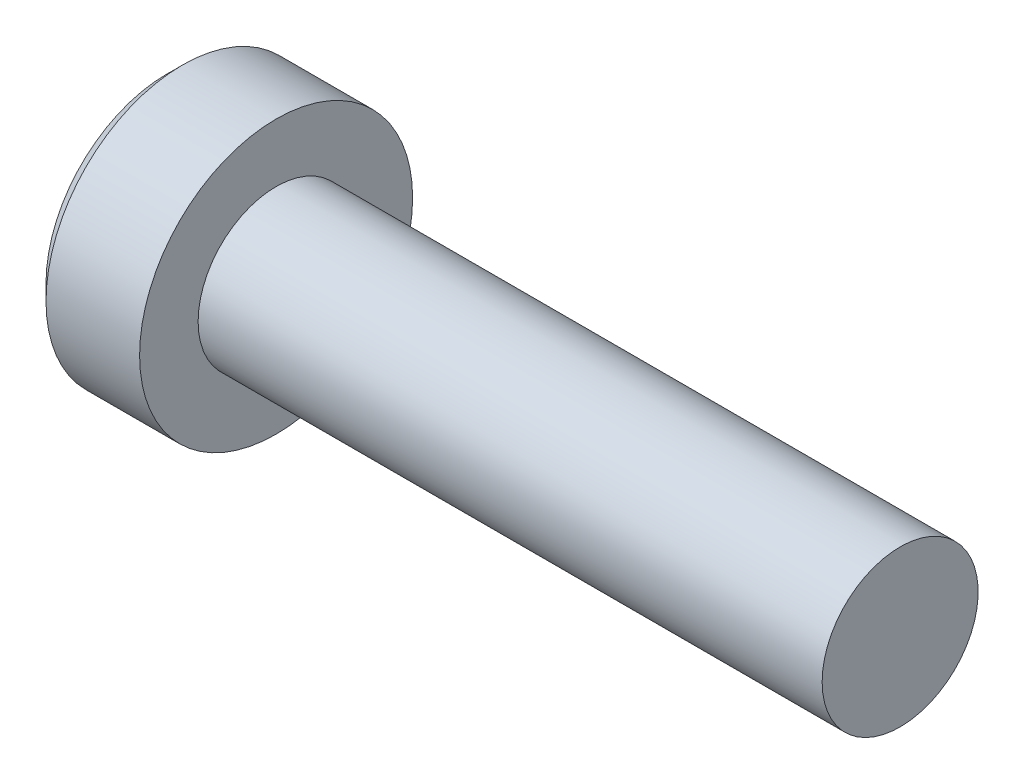
ISO-10303-21;
HEADER;
FILE_DESCRIPTION(('STEP AP214'),'2;1');
FILE_NAME('part.step','',(''),(''),'','','');
FILE_SCHEMA(('AUTOMOTIVE_DESIGN { 1 0 10303 214 1 1 1 1 }'));
ENDSEC;
DATA;
#1=APPLICATION_CONTEXT('core data for automotive mechanical design processes');
#2=APPLICATION_PROTOCOL_DEFINITION('international standard','automotive_design',2000,#1);
#3=PRODUCT_CONTEXT('',#1,'mechanical');
#4=PRODUCT('Part','Part','',(#3));
#5=PRODUCT_RELATED_PRODUCT_CATEGORY('part','',(#4));
#6=PRODUCT_DEFINITION_FORMATION('','',#4);
#7=PRODUCT_DEFINITION_CONTEXT('part definition',#1,'design');
#8=PRODUCT_DEFINITION('design','',#6,#7);
#9=PRODUCT_DEFINITION_SHAPE('','',#8);
#10=(LENGTH_UNIT() NAMED_UNIT(*) SI_UNIT(.MILLI.,.METRE.));
#11=(NAMED_UNIT(*) PLANE_ANGLE_UNIT() SI_UNIT($,.RADIAN.));
#12=(NAMED_UNIT(*) SI_UNIT($,.STERADIAN.) SOLID_ANGLE_UNIT());
#13=UNCERTAINTY_MEASURE_WITH_UNIT(LENGTH_MEASURE(1.E-05),#10,'distance_accuracy_value','');
#14=(GEOMETRIC_REPRESENTATION_CONTEXT(3) GLOBAL_UNCERTAINTY_ASSIGNED_CONTEXT((#13)) GLOBAL_UNIT_ASSIGNED_CONTEXT((#10,
#11,#12)) REPRESENTATION_CONTEXT('',''));
#15=CARTESIAN_POINT('',(0.,0.,0.));
#16=DIRECTION('',(0.,0.,1.));
#17=DIRECTION('',(1.,0.,0.));
#18=AXIS2_PLACEMENT_3D('',#15,#16,#17);
#19=CARTESIAN_POINT('',(-0.799999999999999,0.,0.));
#20=DIRECTION('',(-1.,0.,0.));
#21=DIRECTION('',(0.,0.,1.));
#22=AXIS2_PLACEMENT_3D('',#19,#20,#21);
#23=PLANE('',#22);
#24=CARTESIAN_POINT('',(-0.799999999999999,0.,0.));
#25=DIRECTION('',(-1.,0.,0.));
#26=DIRECTION('',(0.,0.,1.));
#27=AXIS2_PLACEMENT_3D('',#24,#25,#26);
#28=CIRCLE('',#27,1.5);
#29=CARTESIAN_POINT('',(-0.799999999999999,0.,1.5));
#30=VERTEX_POINT('',#29);
#31=CARTESIAN_POINT('',(-0.799999999999999,1.29903810567666,0.75));
#32=VERTEX_POINT('',#31);
#33=EDGE_CURVE('E190',#30,#32,#28,.T.);
#34=ORIENTED_EDGE('',*,*,#33,.F.);
#35=DIRECTION('',(0.,1.,0.));
#36=VECTOR('',#35,1.);
#37=CARTESIAN_POINT('',(-0.799999999999999,-0.86602540378444,1.5));
#38=LINE('',#37,#36);
#39=CARTESIAN_POINT('',(-0.799999999999999,0.866025403784438,1.5));
#40=VERTEX_POINT('',#39);
#41=EDGE_CURVE('E243',#30,#40,#38,.T.);
#42=ORIENTED_EDGE('',*,*,#41,.T.);
#43=DIRECTION('',(0.,0.5,-0.866025403784439));
#44=VECTOR('',#43,1.);
#45=CARTESIAN_POINT('',(-0.799999999999999,0.866025403784438,1.5));
#46=LINE('',#45,#44);
#47=EDGE_CURVE('E264',#40,#32,#46,.T.);
#48=ORIENTED_EDGE('',*,*,#47,.T.);
#49=EDGE_LOOP('',(#34,#42,#48));
#50=FACE_BOUND('',#49,.T.);
#51=ADVANCED_FACE('F41',(#50),#23,.T.);
#52=CARTESIAN_POINT('',(-0.799999999999999,1.29903810567666,-0.75));
#53=VERTEX_POINT('',#52);
#54=EDGE_CURVE('E196',#32,#53,#28,.T.);
#55=ORIENTED_EDGE('',*,*,#54,.F.);
#56=CARTESIAN_POINT('',(-0.799999999999999,1.73205080756888,0.));
#57=VERTEX_POINT('',#56);
#58=EDGE_CURVE('E223',#32,#57,#46,.T.);
#59=ORIENTED_EDGE('',*,*,#58,.T.);
#60=DIRECTION('',(0.,-0.5,-0.866025403784439));
#61=VECTOR('',#60,1.);
#62=CARTESIAN_POINT('',(-0.799999999999999,1.73205080756888,0.));
#63=LINE('',#62,#61);
#64=EDGE_CURVE('E261',#57,#53,#63,.T.);
#65=ORIENTED_EDGE('',*,*,#64,.T.);
#66=EDGE_LOOP('',(#55,#59,#65));
#67=FACE_BOUND('',#66,.T.);
#68=ADVANCED_FACE('F128',(#67),#23,.T.);
#69=CARTESIAN_POINT('',(-0.799999999999999,0.,-1.5));
#70=VERTEX_POINT('',#69);
#71=EDGE_CURVE('E198',#53,#70,#28,.T.);
#72=ORIENTED_EDGE('',*,*,#71,.F.);
#73=CARTESIAN_POINT('',(-0.799999999999999,0.866025403784438,-1.5));
#74=VERTEX_POINT('',#73);
#75=EDGE_CURVE('E263',#53,#74,#63,.T.);
#76=ORIENTED_EDGE('',*,*,#75,.T.);
#77=DIRECTION('',(0.,-1.,0.));
#78=VECTOR('',#77,1.);
#79=CARTESIAN_POINT('',(-0.799999999999999,0.866025403784438,-1.5));
#80=LINE('',#79,#78);
#81=EDGE_CURVE('E257',#74,#70,#80,.T.);
#82=ORIENTED_EDGE('',*,*,#81,.T.);
#83=EDGE_LOOP('',(#72,#76,#82));
#84=FACE_BOUND('',#83,.T.);
#85=ADVANCED_FACE('F133',(#84),#23,.T.);
#86=CARTESIAN_POINT('',(-0.799999999999999,-1.29903810567666,-0.75));
#87=VERTEX_POINT('',#86);
#88=EDGE_CURVE('E201',#70,#87,#28,.T.);
#89=ORIENTED_EDGE('',*,*,#88,.F.);
#90=CARTESIAN_POINT('',(-0.799999999999999,-0.866025403784439,-1.5));
#91=VERTEX_POINT('',#90);
#92=EDGE_CURVE('E260',#70,#91,#80,.T.);
#93=ORIENTED_EDGE('',*,*,#92,.T.);
#94=DIRECTION('',(0.,-0.5,0.866025403784439));
#95=VECTOR('',#94,1.);
#96=CARTESIAN_POINT('',(-0.799999999999999,-0.866025403784439,-1.5));
#97=LINE('',#96,#95);
#98=EDGE_CURVE('E252',#91,#87,#97,.T.);
#99=ORIENTED_EDGE('',*,*,#98,.T.);
#100=EDGE_LOOP('',(#89,#93,#99));
#101=FACE_BOUND('',#100,.T.);
#102=ADVANCED_FACE('F180',(#101),#23,.T.);
#103=CARTESIAN_POINT('',(-0.799999999999999,-1.29903810567666,0.75));
#104=VERTEX_POINT('',#103);
#105=EDGE_CURVE('E56',#87,#104,#28,.T.);
#106=ORIENTED_EDGE('',*,*,#105,.F.);
#107=CARTESIAN_POINT('',(-0.799999999999999,-1.73205080756888,0.));
#108=VERTEX_POINT('',#107);
#109=EDGE_CURVE('E256',#87,#108,#97,.T.);
#110=ORIENTED_EDGE('',*,*,#109,.T.);
#111=DIRECTION('',(0.,0.5,0.866025403784439));
#112=VECTOR('',#111,1.);
#113=CARTESIAN_POINT('',(-0.799999999999999,-1.73205080756888,0.));
#114=LINE('',#113,#112);
#115=EDGE_CURVE('E245',#108,#104,#114,.T.);
#116=ORIENTED_EDGE('',*,*,#115,.T.);
#117=EDGE_LOOP('',(#106,#110,#116));
#118=FACE_BOUND('',#117,.T.);
#119=ADVANCED_FACE('F126',(#118),#23,.T.);
#120=CARTESIAN_POINT('',(16.,0.,0.));
#121=DIRECTION('',(-1.,0.,0.));
#122=DIRECTION('',(0.,0.,1.));
#123=AXIS2_PLACEMENT_3D('',#120,#121,#122);
#124=PLANE('',#123);
#125=CARTESIAN_POINT('',(16.,0.,0.));
#126=DIRECTION('',(-1.,0.,0.));
#127=DIRECTION('',(0.,0.,1.));
#128=AXIS2_PLACEMENT_3D('',#125,#126,#127);
#129=CIRCLE('',#128,2.);
#130=CARTESIAN_POINT('',(16.,0.,2.));
#131=VERTEX_POINT('',#130);
#132=EDGE_CURVE('E184',#131,#131,#129,.T.);
#133=ORIENTED_EDGE('',*,*,#132,.F.);
#134=EDGE_LOOP('',(#133));
#135=FACE_BOUND('',#134,.T.);
#136=ADVANCED_FACE('F173',(#135),#124,.F.);
#137=CARTESIAN_POINT('',(-2.8,0.,0.));
#138=DIRECTION('',(-1.,0.,0.));
#139=DIRECTION('',(0.,0.,1.));
#140=AXIS2_PLACEMENT_3D('',#137,#138,#139);
#141=CYLINDRICAL_SURFACE('',#140,2.);
#142=CARTESIAN_POINT('',(0.,0.,0.));
#143=DIRECTION('',(-1.,0.,0.));
#144=DIRECTION('',(0.,0.,1.));
#145=AXIS2_PLACEMENT_3D('',#142,#143,#144);
#146=CIRCLE('',#145,2.);
#147=CARTESIAN_POINT('',(0.,0.,2.));
#148=VERTEX_POINT('',#147);
#149=EDGE_CURVE('E187',#148,#148,#146,.T.);
#150=ORIENTED_EDGE('',*,*,#149,.F.);
#151=EDGE_LOOP('',(#150));
#152=FACE_BOUND('',#151,.T.);
#153=ORIENTED_EDGE('',*,*,#132,.T.);
#154=EDGE_LOOP('',(#153));
#155=FACE_BOUND('',#154,.T.);
#156=ADVANCED_FACE('F170',(#152,#155),#141,.T.);
#157=CARTESIAN_POINT('',(0.,2.,0.));
#158=DIRECTION('',(-1.,0.,0.));
#159=DIRECTION('',(0.,0.,1.));
#160=AXIS2_PLACEMENT_3D('',#157,#158,#159);
#161=PLANE('',#160);
#162=CARTESIAN_POINT('',(0.,0.,0.));
#163=DIRECTION('',(-1.,0.,0.));
#164=DIRECTION('',(0.,0.,1.));
#165=AXIS2_PLACEMENT_3D('',#162,#163,#164);
#166=CIRCLE('',#165,3.5);
#167=CARTESIAN_POINT('',(0.,0.,3.5));
#168=VERTEX_POINT('',#167);
#169=EDGE_CURVE('E192',#168,#168,#166,.T.);
#170=ORIENTED_EDGE('',*,*,#169,.F.);
#171=EDGE_LOOP('',(#170));
#172=FACE_BOUND('',#171,.T.);
#173=ORIENTED_EDGE('',*,*,#149,.T.);
#174=EDGE_LOOP('',(#173));
#175=FACE_BOUND('',#174,.T.);
#176=ADVANCED_FACE('F166',(#172,#175),#161,.F.);
#177=CARTESIAN_POINT('',(-2.8,0.,0.));
#178=DIRECTION('',(-1.,0.,0.));
#179=DIRECTION('',(0.,0.,1.));
#180=AXIS2_PLACEMENT_3D('',#177,#178,#179);
#181=CYLINDRICAL_SURFACE('',#180,3.5);
#182=CARTESIAN_POINT('',(-2.4,0.,0.));
#183=DIRECTION('',(1.,0.,0.));
#184=DIRECTION('',(0.,0.,-1.));
#185=AXIS2_PLACEMENT_3D('',#182,#183,#184);
#186=CIRCLE('',#185,3.5);
#187=CARTESIAN_POINT('',(-2.4,0.,-3.5));
#188=VERTEX_POINT('',#187);
#189=EDGE_CURVE('E11',#188,#188,#186,.T.);
#190=ORIENTED_EDGE('',*,*,#189,.T.);
#191=EDGE_LOOP('',(#190));
#192=FACE_BOUND('',#191,.T.);
#193=ORIENTED_EDGE('',*,*,#169,.T.);
#194=EDGE_LOOP('',(#193));
#195=FACE_BOUND('',#194,.T.);
#196=ADVANCED_FACE('F162',(#192,#195),#181,.T.);
#197=CARTESIAN_POINT('',(-2.8,3.5,0.));
#198=DIRECTION('',(1.,0.,0.));
#199=DIRECTION('',(0.,0.,-1.));
#200=AXIS2_PLACEMENT_3D('',#197,#198,#199);
#201=PLANE('',#200);
#202=CARTESIAN_POINT('',(-2.8,0.,0.));
#203=DIRECTION('',(1.,0.,0.));
#204=DIRECTION('',(0.,0.,-1.));
#205=AXIS2_PLACEMENT_3D('',#202,#203,#204);
#206=CIRCLE('',#205,3.1);
#207=CARTESIAN_POINT('',(-2.8,0.,-3.1));
#208=VERTEX_POINT('',#207);
#209=EDGE_CURVE('E49',#208,#208,#206,.F.);
#210=ORIENTED_EDGE('',*,*,#209,.T.);
#211=EDGE_LOOP('',(#210));
#212=FACE_BOUND('',#211,.T.);
#213=DIRECTION('',(0.,-0.5,-0.866025403784439));
#214=VECTOR('',#213,1.);
#215=CARTESIAN_POINT('',(-2.8,1.73205080756888,0.));
#216=LINE('',#215,#214);
#217=CARTESIAN_POINT('',(-2.8,1.73205080756888,0.));
#218=VERTEX_POINT('',#217);
#219=CARTESIAN_POINT('',(-2.8,0.866025403784438,-1.5));
#220=VERTEX_POINT('',#219);
#221=EDGE_CURVE('E203',#218,#220,#216,.T.);
#222=ORIENTED_EDGE('',*,*,#221,.F.);
#223=DIRECTION('',(0.,0.5,-0.866025403784439));
#224=VECTOR('',#223,1.);
#225=CARTESIAN_POINT('',(-2.8,0.866025403784438,1.5));
#226=LINE('',#225,#224);
#227=CARTESIAN_POINT('',(-2.8,0.866025403784438,1.5));
#228=VERTEX_POINT('',#227);
#229=EDGE_CURVE('E64',#228,#218,#226,.T.);
#230=ORIENTED_EDGE('',*,*,#229,.F.);
#231=DIRECTION('',(0.,1.,0.));
#232=VECTOR('',#231,1.);
#233=CARTESIAN_POINT('',(-2.8,-0.86602540378444,1.5));
#234=LINE('',#233,#232);
#235=CARTESIAN_POINT('',(-2.8,-0.86602540378444,1.5));
#236=VERTEX_POINT('',#235);
#237=EDGE_CURVE('E220',#236,#228,#234,.T.);
#238=ORIENTED_EDGE('',*,*,#237,.F.);
#239=DIRECTION('',(0.,0.5,0.866025403784439));
#240=VECTOR('',#239,1.);
#241=CARTESIAN_POINT('',(-2.8,-1.73205080756888,0.));
#242=LINE('',#241,#240);
#243=CARTESIAN_POINT('',(-2.8,-1.73205080756888,0.));
#244=VERTEX_POINT('',#243);
#245=EDGE_CURVE('E217',#244,#236,#242,.T.);
#246=ORIENTED_EDGE('',*,*,#245,.F.);
#247=DIRECTION('',(0.,-0.5,0.866025403784439));
#248=VECTOR('',#247,1.);
#249=CARTESIAN_POINT('',(-2.8,-0.866025403784439,-1.5));
#250=LINE('',#249,#248);
#251=CARTESIAN_POINT('',(-2.8,-0.866025403784439,-1.5));
#252=VERTEX_POINT('',#251);
#253=EDGE_CURVE('E214',#252,#244,#250,.T.);
#254=ORIENTED_EDGE('',*,*,#253,.F.);
#255=DIRECTION('',(0.,-1.,0.));
#256=VECTOR('',#255,1.);
#257=CARTESIAN_POINT('',(-2.8,0.866025403784438,-1.5));
#258=LINE('',#257,#256);
#259=EDGE_CURVE('E206',#220,#252,#258,.T.);
#260=ORIENTED_EDGE('',*,*,#259,.F.);
#261=EDGE_LOOP('',(#222,#230,#238,#246,#254,#260));
#262=FACE_BOUND('',#261,.T.);
#263=ADVANCED_FACE('F159',(#212,#262),#201,.F.);
#264=CARTESIAN_POINT('',(-0.799999999999999,0.866025403784438,1.5));
#265=DIRECTION('',(0.,0.866025403784439,0.5));
#266=DIRECTION('',(0.,-0.5,0.866025403784439));
#267=AXIS2_PLACEMENT_3D('',#264,#265,#266);
#268=PLANE('',#267);
#269=ORIENTED_EDGE('',*,*,#229,.T.);
#270=DIRECTION('',(-1.,0.,0.));
#271=VECTOR('',#270,1.);
#272=CARTESIAN_POINT('',(-0.799999999999999,1.73205080756888,0.));
#273=LINE('',#272,#271);
#274=EDGE_CURVE('E234',#57,#218,#273,.T.);
#275=ORIENTED_EDGE('',*,*,#274,.F.);
#276=ORIENTED_EDGE('',*,*,#58,.F.);
#277=ORIENTED_EDGE('',*,*,#47,.F.);
#278=DIRECTION('',(-1.,0.,0.));
#279=VECTOR('',#278,1.);
#280=CARTESIAN_POINT('',(-0.799999999999999,0.866025403784438,1.5));
#281=LINE('',#280,#279);
#282=EDGE_CURVE('E224',#40,#228,#281,.T.);
#283=ORIENTED_EDGE('',*,*,#282,.T.);
#284=EDGE_LOOP('',(#269,#275,#276,#277,#283));
#285=FACE_BOUND('',#284,.T.);
#286=ADVANCED_FACE('F141',(#285),#268,.F.);
#287=CARTESIAN_POINT('',(-0.799999999999999,-0.86602540378444,1.5));
#288=DIRECTION('',(0.,0.,1.));
#289=DIRECTION('',(1.,0.,0.));
#290=AXIS2_PLACEMENT_3D('',#287,#288,#289);
#291=PLANE('',#290);
#292=ORIENTED_EDGE('',*,*,#237,.T.);
#293=ORIENTED_EDGE('',*,*,#282,.F.);
#294=ORIENTED_EDGE('',*,*,#41,.F.);
#295=CARTESIAN_POINT('',(-0.799999999999999,-0.86602540378444,1.5));
#296=VERTEX_POINT('',#295);
#297=EDGE_CURVE('E209',#296,#30,#38,.T.);
#298=ORIENTED_EDGE('',*,*,#297,.F.);
#299=DIRECTION('',(-1.,0.,0.));
#300=VECTOR('',#299,1.);
#301=CARTESIAN_POINT('',(-0.799999999999999,-0.86602540378444,1.5));
#302=LINE('',#301,#300);
#303=EDGE_CURVE('E226',#296,#236,#302,.T.);
#304=ORIENTED_EDGE('',*,*,#303,.T.);
#305=EDGE_LOOP('',(#292,#293,#294,#298,#304));
#306=FACE_BOUND('',#305,.T.);
#307=ADVANCED_FACE('F137',(#306),#291,.F.);
#308=CARTESIAN_POINT('',(-0.799999999999999,-1.73205080756888,0.));
#309=DIRECTION('',(0.,-0.866025403784439,0.5));
#310=DIRECTION('',(0.,-0.5,-0.866025403784439));
#311=AXIS2_PLACEMENT_3D('',#308,#309,#310);
#312=PLANE('',#311);
#313=ORIENTED_EDGE('',*,*,#245,.T.);
#314=ORIENTED_EDGE('',*,*,#303,.F.);
#315=EDGE_CURVE('E250',#104,#296,#114,.T.);
#316=ORIENTED_EDGE('',*,*,#315,.F.);
#317=ORIENTED_EDGE('',*,*,#115,.F.);
#318=DIRECTION('',(-1.,0.,0.));
#319=VECTOR('',#318,1.);
#320=CARTESIAN_POINT('',(-0.799999999999999,-1.73205080756888,0.));
#321=LINE('',#320,#319);
#322=EDGE_CURVE('E228',#108,#244,#321,.T.);
#323=ORIENTED_EDGE('',*,*,#322,.T.);
#324=EDGE_LOOP('',(#313,#314,#316,#317,#323));
#325=FACE_BOUND('',#324,.T.);
#326=ADVANCED_FACE('F140',(#325),#312,.F.);
#327=CARTESIAN_POINT('',(-0.799999999999999,-0.866025403784439,-1.5));
#328=DIRECTION('',(0.,-0.866025403784439,-0.5));
#329=DIRECTION('',(0.,0.5,-0.866025403784439));
#330=AXIS2_PLACEMENT_3D('',#327,#328,#329);
#331=PLANE('',#330);
#332=ORIENTED_EDGE('',*,*,#253,.T.);
#333=ORIENTED_EDGE('',*,*,#322,.F.);
#334=ORIENTED_EDGE('',*,*,#109,.F.);
#335=ORIENTED_EDGE('',*,*,#98,.F.);
#336=DIRECTION('',(-1.,0.,0.));
#337=VECTOR('',#336,1.);
#338=CARTESIAN_POINT('',(-0.799999999999999,-0.866025403784439,-1.5));
#339=LINE('',#338,#337);
#340=EDGE_CURVE('E230',#91,#252,#339,.T.);
#341=ORIENTED_EDGE('',*,*,#340,.T.);
#342=EDGE_LOOP('',(#332,#333,#334,#335,#341));
#343=FACE_BOUND('',#342,.T.);
#344=ADVANCED_FACE('F145',(#343),#331,.F.);
#345=CARTESIAN_POINT('',(-0.799999999999999,0.866025403784438,-1.5));
#346=DIRECTION('',(0.,0.,-1.));
#347=DIRECTION('',(-1.,0.,0.));
#348=AXIS2_PLACEMENT_3D('',#345,#346,#347);
#349=PLANE('',#348);
#350=ORIENTED_EDGE('',*,*,#259,.T.);
#351=ORIENTED_EDGE('',*,*,#340,.F.);
#352=ORIENTED_EDGE('',*,*,#92,.F.);
#353=ORIENTED_EDGE('',*,*,#81,.F.);
#354=DIRECTION('',(-1.,0.,0.));
#355=VECTOR('',#354,1.);
#356=CARTESIAN_POINT('',(-0.799999999999999,0.866025403784438,-1.5));
#357=LINE('',#356,#355);
#358=EDGE_CURVE('E232',#74,#220,#357,.T.);
#359=ORIENTED_EDGE('',*,*,#358,.T.);
#360=EDGE_LOOP('',(#350,#351,#352,#353,#359));
#361=FACE_BOUND('',#360,.T.);
#362=ADVANCED_FACE('F149',(#361),#349,.F.);
#363=CARTESIAN_POINT('',(-0.799999999999999,1.73205080756888,0.));
#364=DIRECTION('',(0.,0.866025403784439,-0.5));
#365=DIRECTION('',(0.,0.5,0.866025403784439));
#366=AXIS2_PLACEMENT_3D('',#363,#364,#365);
#367=PLANE('',#366);
#368=ORIENTED_EDGE('',*,*,#221,.T.);
#369=ORIENTED_EDGE('',*,*,#358,.F.);
#370=ORIENTED_EDGE('',*,*,#75,.F.);
#371=ORIENTED_EDGE('',*,*,#64,.F.);
#372=ORIENTED_EDGE('',*,*,#274,.T.);
#373=EDGE_LOOP('',(#368,#369,#370,#371,#372));
#374=FACE_BOUND('',#373,.T.);
#375=ADVANCED_FACE('F123',(#374),#367,.F.);
#376=EDGE_CURVE('E186',#104,#30,#28,.T.);
#377=ORIENTED_EDGE('',*,*,#376,.F.);
#378=ORIENTED_EDGE('',*,*,#315,.T.);
#379=ORIENTED_EDGE('',*,*,#297,.T.);
#380=EDGE_LOOP('',(#377,#378,#379));
#381=FACE_BOUND('',#380,.T.);
#382=ADVANCED_FACE('F116',(#381),#23,.T.);
#383=CARTESIAN_POINT('',(0.0660254037844278,0.,0.));
#384=DIRECTION('',(-1.,0.,0.));
#385=DIRECTION('',(0.,0.,1.));
#386=AXIS2_PLACEMENT_3D('',#383,#384,#385);
#387=CONICAL_SURFACE('',#386,0.,1.0471975511966);
#388=ORIENTED_EDGE('',*,*,#33,.T.);
#389=ORIENTED_EDGE('',*,*,#54,.T.);
#390=ORIENTED_EDGE('',*,*,#71,.T.);
#391=ORIENTED_EDGE('',*,*,#88,.T.);
#392=ORIENTED_EDGE('',*,*,#105,.T.);
#393=ORIENTED_EDGE('',*,*,#376,.T.);
#394=EDGE_LOOP('',(#388,#389,#390,#391,#392,#393));
#395=FACE_BOUND('',#394,.T.);
#396=CARTESIAN_POINT('',(0.0660254037844278,0.,0.));
#397=VERTEX_POINT('',#396);
#398=VERTEX_LOOP('',#397);
#399=FACE_BOUND('',#398,.T.);
#400=ADVANCED_FACE('F114',(#395,#399),#387,.F.);
#401=CARTESIAN_POINT('',(-2.8,0.,0.));
#402=DIRECTION('',(1.,0.,0.));
#403=DIRECTION('',(0.,0.,-1.));
#404=AXIS2_PLACEMENT_3D('',#401,#402,#403);
#405=CONICAL_SURFACE('',#404,3.1,0.785398163397445);
#406=ORIENTED_EDGE('',*,*,#189,.F.);
#407=EDGE_LOOP('',(#406));
#408=FACE_BOUND('',#407,.T.);
#409=ORIENTED_EDGE('',*,*,#209,.F.);
#410=EDGE_LOOP('',(#409));
#411=FACE_BOUND('',#410,.T.);
#412=ADVANCED_FACE('F43',(#408,#411),#405,.T.);
#413=CLOSED_SHELL('',(#51,#68,#85,#102,#119,#136,#156,#176,#196,#263,#286,#307,#326,#344,#362,
#375,#382,#400,#412));
#414=MANIFOLD_SOLID_BREP('B2',#413);
#415=ADVANCED_BREP_SHAPE_REPRESENTATION('',(#18,#414),#14);
#416=SHAPE_DEFINITION_REPRESENTATION(#9,#415);
ENDSEC;
END-ISO-10303-21;
